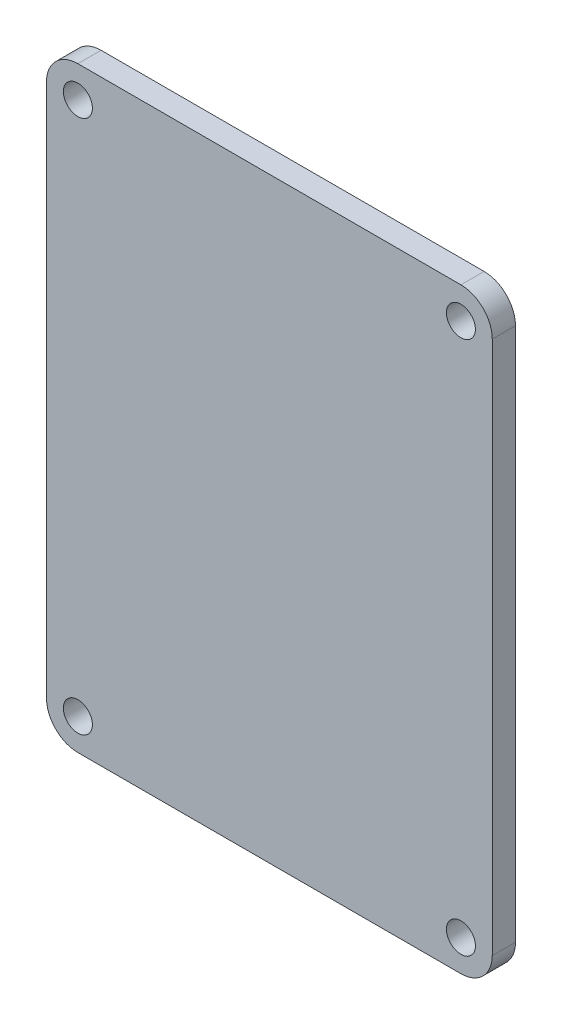
ISO-10303-21;
HEADER;
FILE_DESCRIPTION(('STEP AP214'),'2;1');
FILE_NAME('part.step','',(''),(''),'','','');
FILE_SCHEMA(('AUTOMOTIVE_DESIGN { 1 0 10303 214 1 1 1 1 }'));
ENDSEC;
DATA;
#1=APPLICATION_CONTEXT('core data for automotive mechanical design processes');
#2=APPLICATION_PROTOCOL_DEFINITION('international standard','automotive_design',2000,#1);
#3=PRODUCT_CONTEXT('',#1,'mechanical');
#4=PRODUCT('Part','Part','',(#3));
#5=PRODUCT_RELATED_PRODUCT_CATEGORY('part','',(#4));
#6=PRODUCT_DEFINITION_FORMATION('','',#4);
#7=PRODUCT_DEFINITION_CONTEXT('part definition',#1,'design');
#8=PRODUCT_DEFINITION('design','',#6,#7);
#9=PRODUCT_DEFINITION_SHAPE('','',#8);
#10=(LENGTH_UNIT() NAMED_UNIT(*) SI_UNIT(.MILLI.,.METRE.));
#11=(NAMED_UNIT(*) PLANE_ANGLE_UNIT() SI_UNIT($,.RADIAN.));
#12=(NAMED_UNIT(*) SI_UNIT($,.STERADIAN.) SOLID_ANGLE_UNIT());
#13=UNCERTAINTY_MEASURE_WITH_UNIT(LENGTH_MEASURE(1.E-05),#10,'distance_accuracy_value','');
#14=(GEOMETRIC_REPRESENTATION_CONTEXT(3) GLOBAL_UNCERTAINTY_ASSIGNED_CONTEXT((#13)) GLOBAL_UNIT_ASSIGNED_CONTEXT((#10,
#11,#12)) REPRESENTATION_CONTEXT('',''));
#15=CARTESIAN_POINT('',(0.,0.,0.));
#16=DIRECTION('',(0.,0.,1.));
#17=DIRECTION('',(1.,0.,0.));
#18=AXIS2_PLACEMENT_3D('',#15,#16,#17);
#19=CARTESIAN_POINT('',(16.161651473896,0.,5.57911505586116));
#20=DIRECTION('',(-1.,0.,0.));
#21=DIRECTION('',(0.,0.,1.));
#22=AXIS2_PLACEMENT_3D('',#19,#20,#21);
#23=PLANE('',#22);
#24=DIRECTION('',(0.,1.,0.));
#25=VECTOR('',#24,1.);
#26=CARTESIAN_POINT('',(16.161651473896,0.,3.57911505586116));
#27=LINE('',#26,#25);
#28=CARTESIAN_POINT('',(16.161651473896,-27.5486521236593,3.57911505586116));
#29=VERTEX_POINT('',#28);
#30=CARTESIAN_POINT('',(16.161651473896,18.4513478763407,3.57911505586116));
#31=VERTEX_POINT('',#30);
#32=EDGE_CURVE('E133',#29,#31,#27,.T.);
#33=ORIENTED_EDGE('',*,*,#32,.T.);
#34=DIRECTION('',(0.,0.,-1.));
#35=VECTOR('',#34,1.);
#36=CARTESIAN_POINT('',(16.161651473896,18.4513478763407,5.57911505586116));
#37=LINE('',#36,#35);
#38=CARTESIAN_POINT('',(16.161651473896,18.4513478763407,5.57911505586116));
#39=VERTEX_POINT('',#38);
#40=EDGE_CURVE('E11',#39,#31,#37,.T.);
#41=ORIENTED_EDGE('',*,*,#40,.F.);
#42=DIRECTION('',(0.,1.,0.));
#43=VECTOR('',#42,1.);
#44=CARTESIAN_POINT('',(16.161651473896,0.,5.57911505586116));
#45=LINE('',#44,#43);
#46=CARTESIAN_POINT('',(16.161651473896,-27.5486521236593,5.57911505586116));
#47=VERTEX_POINT('',#46);
#48=EDGE_CURVE('E148',#47,#39,#45,.T.);
#49=ORIENTED_EDGE('',*,*,#48,.F.);
#50=DIRECTION('',(0.,0.,-1.));
#51=VECTOR('',#50,1.);
#52=CARTESIAN_POINT('',(16.161651473896,-27.5486521236593,5.57911505586116));
#53=LINE('',#52,#51);
#54=EDGE_CURVE('E129',#47,#29,#53,.T.);
#55=ORIENTED_EDGE('',*,*,#54,.T.);
#56=EDGE_LOOP('',(#33,#41,#49,#55));
#57=FACE_BOUND('',#56,.T.);
#58=ADVANCED_FACE('F37',(#57),#23,.F.);
#59=CARTESIAN_POINT('',(13.4616514738959,18.4513478763407,5.57911505586116));
#60=DIRECTION('',(0.,0.,-1.));
#61=DIRECTION('',(-1.,0.,0.));
#62=AXIS2_PLACEMENT_3D('',#59,#60,#61);
#63=CYLINDRICAL_SURFACE('',#62,2.70000000000008);
#64=CARTESIAN_POINT('',(13.4616514738959,18.4513478763407,3.57911505586116));
#65=DIRECTION('',(0.,0.,1.));
#66=DIRECTION('',(1.,0.,0.));
#67=AXIS2_PLACEMENT_3D('',#64,#65,#66);
#68=CIRCLE('',#67,2.70000000000008);
#69=CARTESIAN_POINT('',(13.4616514738959,21.1513478763407,3.57911505586116));
#70=VERTEX_POINT('',#69);
#71=EDGE_CURVE('E136',#31,#70,#68,.T.);
#72=ORIENTED_EDGE('',*,*,#71,.T.);
#73=DIRECTION('',(0.,0.,-1.));
#74=VECTOR('',#73,1.);
#75=CARTESIAN_POINT('',(13.4616514738959,21.1513478763407,5.57911505586116));
#76=LINE('',#75,#74);
#77=CARTESIAN_POINT('',(13.4616514738959,21.1513478763407,5.57911505586116));
#78=VERTEX_POINT('',#77);
#79=EDGE_CURVE('E45',#78,#70,#76,.T.);
#80=ORIENTED_EDGE('',*,*,#79,.F.);
#81=CARTESIAN_POINT('',(13.4616514738959,18.4513478763407,5.57911505586116));
#82=DIRECTION('',(0.,0.,1.));
#83=DIRECTION('',(1.,0.,0.));
#84=AXIS2_PLACEMENT_3D('',#81,#82,#83);
#85=CIRCLE('',#84,2.70000000000008);
#86=EDGE_CURVE('E96',#39,#78,#85,.T.);
#87=ORIENTED_EDGE('',*,*,#86,.F.);
#88=ORIENTED_EDGE('',*,*,#40,.T.);
#89=EDGE_LOOP('',(#72,#80,#87,#88));
#90=FACE_BOUND('',#89,.T.);
#91=ADVANCED_FACE('F244',(#90),#63,.T.);
#92=CARTESIAN_POINT('',(0.,21.1513478763407,5.57911505586116));
#93=DIRECTION('',(0.,-1.,0.));
#94=DIRECTION('',(1.,0.,0.));
#95=AXIS2_PLACEMENT_3D('',#92,#93,#94);
#96=PLANE('',#95);
#97=DIRECTION('',(-1.,0.,0.));
#98=VECTOR('',#97,1.);
#99=CARTESIAN_POINT('',(0.,21.1513478763407,3.57911505586116));
#100=LINE('',#99,#98);
#101=CARTESIAN_POINT('',(-19.5383485261041,21.1513478763405,3.57911505586116));
#102=VERTEX_POINT('',#101);
#103=EDGE_CURVE('E139',#70,#102,#100,.T.);
#104=ORIENTED_EDGE('',*,*,#103,.T.);
#105=DIRECTION('',(0.,0.,-1.));
#106=VECTOR('',#105,1.);
#107=CARTESIAN_POINT('',(-19.5383485261041,21.1513478763405,5.57911505586116));
#108=LINE('',#107,#106);
#109=CARTESIAN_POINT('',(-19.5383485261041,21.1513478763405,5.57911505586116));
#110=VERTEX_POINT('',#109);
#111=EDGE_CURVE('E155',#110,#102,#108,.T.);
#112=ORIENTED_EDGE('',*,*,#111,.F.);
#113=DIRECTION('',(-1.,0.,0.));
#114=VECTOR('',#113,1.);
#115=CARTESIAN_POINT('',(0.,21.1513478763407,5.57911505586116));
#116=LINE('',#115,#114);
#117=EDGE_CURVE('E163',#78,#110,#116,.T.);
#118=ORIENTED_EDGE('',*,*,#117,.F.);
#119=ORIENTED_EDGE('',*,*,#79,.T.);
#120=EDGE_LOOP('',(#104,#112,#118,#119));
#121=FACE_BOUND('',#120,.T.);
#122=ADVANCED_FACE('F161',(#121),#96,.F.);
#123=CARTESIAN_POINT('',(-19.538348526104,18.4513478763405,5.57911505586116));
#124=DIRECTION('',(0.,0.,-1.));
#125=DIRECTION('',(-1.,0.,0.));
#126=AXIS2_PLACEMENT_3D('',#123,#124,#125);
#127=CYLINDRICAL_SURFACE('',#126,2.7);
#128=CARTESIAN_POINT('',(-19.538348526104,18.4513478763405,3.57911505586116));
#129=DIRECTION('',(0.,0.,1.));
#130=DIRECTION('',(1.,0.,0.));
#131=AXIS2_PLACEMENT_3D('',#128,#129,#130);
#132=CIRCLE('',#131,2.7);
#133=CARTESIAN_POINT('',(-22.2383485261041,18.4513478763405,3.57911505586116));
#134=VERTEX_POINT('',#133);
#135=EDGE_CURVE('E141',#102,#134,#132,.T.);
#136=ORIENTED_EDGE('',*,*,#135,.T.);
#137=DIRECTION('',(0.,0.,-1.));
#138=VECTOR('',#137,1.);
#139=CARTESIAN_POINT('',(-22.2383485261041,18.4513478763405,5.57911505586116));
#140=LINE('',#139,#138);
#141=CARTESIAN_POINT('',(-22.2383485261041,18.4513478763405,5.57911505586116));
#142=VERTEX_POINT('',#141);
#143=EDGE_CURVE('E152',#142,#134,#140,.T.);
#144=ORIENTED_EDGE('',*,*,#143,.F.);
#145=CARTESIAN_POINT('',(-19.538348526104,18.4513478763405,5.57911505586116));
#146=DIRECTION('',(0.,0.,1.));
#147=DIRECTION('',(1.,0.,0.));
#148=AXIS2_PLACEMENT_3D('',#145,#146,#147);
#149=CIRCLE('',#148,2.7);
#150=EDGE_CURVE('E175',#110,#142,#149,.T.);
#151=ORIENTED_EDGE('',*,*,#150,.F.);
#152=ORIENTED_EDGE('',*,*,#111,.T.);
#153=EDGE_LOOP('',(#136,#144,#151,#152));
#154=FACE_BOUND('',#153,.T.);
#155=ADVANCED_FACE('F171',(#154),#127,.T.);
#156=CARTESIAN_POINT('',(-22.2383485261041,0.,5.57911505586116));
#157=DIRECTION('',(1.,0.,0.));
#158=DIRECTION('',(0.,0.,-1.));
#159=AXIS2_PLACEMENT_3D('',#156,#157,#158);
#160=PLANE('',#159);
#161=DIRECTION('',(0.,-1.,0.));
#162=VECTOR('',#161,1.);
#163=CARTESIAN_POINT('',(-22.2383485261041,0.,3.57911505586116));
#164=LINE('',#163,#162);
#165=CARTESIAN_POINT('',(-22.2383485261041,-27.5486521236594,3.57911505586116));
#166=VERTEX_POINT('',#165);
#167=EDGE_CURVE('E143',#134,#166,#164,.T.);
#168=ORIENTED_EDGE('',*,*,#167,.T.);
#169=DIRECTION('',(0.,0.,-1.));
#170=VECTOR('',#169,1.);
#171=CARTESIAN_POINT('',(-22.2383485261041,-27.5486521236594,5.57911505586116));
#172=LINE('',#171,#170);
#173=CARTESIAN_POINT('',(-22.2383485261041,-27.5486521236594,5.57911505586116));
#174=VERTEX_POINT('',#173);
#175=EDGE_CURVE('E124',#174,#166,#172,.T.);
#176=ORIENTED_EDGE('',*,*,#175,.F.);
#177=DIRECTION('',(0.,-1.,0.));
#178=VECTOR('',#177,1.);
#179=CARTESIAN_POINT('',(-22.2383485261041,0.,5.57911505586116));
#180=LINE('',#179,#178);
#181=EDGE_CURVE('E115',#142,#174,#180,.T.);
#182=ORIENTED_EDGE('',*,*,#181,.F.);
#183=ORIENTED_EDGE('',*,*,#143,.T.);
#184=EDGE_LOOP('',(#168,#176,#182,#183));
#185=FACE_BOUND('',#184,.T.);
#186=ADVANCED_FACE('F174',(#185),#160,.F.);
#187=CARTESIAN_POINT('',(-19.5383485261041,-27.5486521236594,5.57911505586116));
#188=DIRECTION('',(0.,0.,-1.));
#189=DIRECTION('',(-1.,0.,0.));
#190=AXIS2_PLACEMENT_3D('',#187,#188,#189);
#191=CYLINDRICAL_SURFACE('',#190,2.69999999999999);
#192=CARTESIAN_POINT('',(-19.5383485261041,-27.5486521236594,3.57911505586116));
#193=DIRECTION('',(0.,0.,1.));
#194=DIRECTION('',(1.,0.,0.));
#195=AXIS2_PLACEMENT_3D('',#192,#193,#194);
#196=CIRCLE('',#195,2.69999999999999);
#197=CARTESIAN_POINT('',(-19.5383485261041,-30.2486521236594,3.57911505586116));
#198=VERTEX_POINT('',#197);
#199=EDGE_CURVE('E123',#166,#198,#196,.T.);
#200=ORIENTED_EDGE('',*,*,#199,.T.);
#201=DIRECTION('',(0.,0.,-1.));
#202=VECTOR('',#201,1.);
#203=CARTESIAN_POINT('',(-19.5383485261041,-30.2486521236594,5.57911505586116));
#204=LINE('',#203,#202);
#205=CARTESIAN_POINT('',(-19.5383485261041,-30.2486521236594,5.57911505586116));
#206=VERTEX_POINT('',#205);
#207=EDGE_CURVE('E120',#206,#198,#204,.T.);
#208=ORIENTED_EDGE('',*,*,#207,.F.);
#209=CARTESIAN_POINT('',(-19.5383485261041,-27.5486521236594,5.57911505586116));
#210=DIRECTION('',(0.,0.,1.));
#211=DIRECTION('',(1.,0.,0.));
#212=AXIS2_PLACEMENT_3D('',#209,#210,#211);
#213=CIRCLE('',#212,2.69999999999999);
#214=EDGE_CURVE('E109',#174,#206,#213,.T.);
#215=ORIENTED_EDGE('',*,*,#214,.F.);
#216=ORIENTED_EDGE('',*,*,#175,.T.);
#217=EDGE_LOOP('',(#200,#208,#215,#216));
#218=FACE_BOUND('',#217,.T.);
#219=ADVANCED_FACE('F121',(#218),#191,.T.);
#220=CARTESIAN_POINT('',(0.,-30.2486521236594,5.57911505586116));
#221=DIRECTION('',(0.,1.,0.));
#222=DIRECTION('',(0.,0.,1.));
#223=AXIS2_PLACEMENT_3D('',#220,#221,#222);
#224=PLANE('',#223);
#225=DIRECTION('',(1.,0.,0.));
#226=VECTOR('',#225,1.);
#227=CARTESIAN_POINT('',(0.,-30.2486521236594,3.57911505586116));
#228=LINE('',#227,#226);
#229=CARTESIAN_POINT('',(13.461651473896,-30.2486521236594,3.57911505586116));
#230=VERTEX_POINT('',#229);
#231=EDGE_CURVE('E82',#198,#230,#228,.T.);
#232=ORIENTED_EDGE('',*,*,#231,.T.);
#233=DIRECTION('',(0.,0.,-1.));
#234=VECTOR('',#233,1.);
#235=CARTESIAN_POINT('',(13.461651473896,-30.2486521236594,5.57911505586116));
#236=LINE('',#235,#234);
#237=CARTESIAN_POINT('',(13.461651473896,-30.2486521236594,5.57911505586116));
#238=VERTEX_POINT('',#237);
#239=EDGE_CURVE('E125',#238,#230,#236,.T.);
#240=ORIENTED_EDGE('',*,*,#239,.F.);
#241=DIRECTION('',(1.,0.,0.));
#242=VECTOR('',#241,1.);
#243=CARTESIAN_POINT('',(0.,-30.2486521236594,5.57911505586116));
#244=LINE('',#243,#242);
#245=EDGE_CURVE('E113',#206,#238,#244,.T.);
#246=ORIENTED_EDGE('',*,*,#245,.F.);
#247=ORIENTED_EDGE('',*,*,#207,.T.);
#248=EDGE_LOOP('',(#232,#240,#246,#247));
#249=FACE_BOUND('',#248,.T.);
#250=ADVANCED_FACE('F127',(#249),#224,.F.);
#251=CARTESIAN_POINT('',(13.461651473896,-27.5486521236593,5.57911505586116));
#252=DIRECTION('',(0.,0.,-1.));
#253=DIRECTION('',(-1.,0.,0.));
#254=AXIS2_PLACEMENT_3D('',#251,#252,#253);
#255=CYLINDRICAL_SURFACE('',#254,2.70000000000006);
#256=CARTESIAN_POINT('',(13.461651473896,-27.5486521236593,3.57911505586116));
#257=DIRECTION('',(0.,0.,1.));
#258=DIRECTION('',(1.,0.,0.));
#259=AXIS2_PLACEMENT_3D('',#256,#257,#258);
#260=CIRCLE('',#259,2.70000000000006);
#261=EDGE_CURVE('E88',#230,#29,#260,.T.);
#262=ORIENTED_EDGE('',*,*,#261,.T.);
#263=ORIENTED_EDGE('',*,*,#54,.F.);
#264=CARTESIAN_POINT('',(13.461651473896,-27.5486521236593,5.57911505586116));
#265=DIRECTION('',(0.,0.,1.));
#266=DIRECTION('',(1.,0.,0.));
#267=AXIS2_PLACEMENT_3D('',#264,#265,#266);
#268=CIRCLE('',#267,2.70000000000006);
#269=EDGE_CURVE('E53',#238,#47,#268,.T.);
#270=ORIENTED_EDGE('',*,*,#269,.F.);
#271=ORIENTED_EDGE('',*,*,#239,.T.);
#272=EDGE_LOOP('',(#262,#263,#270,#271));
#273=FACE_BOUND('',#272,.T.);
#274=ADVANCED_FACE('F251',(#273),#255,.T.);
#275=CARTESIAN_POINT('',(0.,0.,5.57911505586116));
#276=DIRECTION('',(0.,0.,1.));
#277=DIRECTION('',(1.,0.,0.));
#278=AXIS2_PLACEMENT_3D('',#275,#276,#277);
#279=PLANE('',#278);
#280=CARTESIAN_POINT('',(-19.538348526104,18.4513478763405,5.57911505586116));
#281=DIRECTION('',(0.,0.,1.));
#282=DIRECTION('',(1.,0.,0.));
#283=AXIS2_PLACEMENT_3D('',#280,#281,#282);
#284=CIRCLE('',#283,1.25);
#285=CARTESIAN_POINT('',(-18.288348526104,18.4513478763405,5.57911505586116));
#286=VERTEX_POINT('',#285);
#287=EDGE_CURVE('E198',#286,#286,#284,.T.);
#288=ORIENTED_EDGE('',*,*,#287,.F.);
#289=EDGE_LOOP('',(#288));
#290=FACE_BOUND('',#289,.T.);
#291=CARTESIAN_POINT('',(13.4616514738959,18.4513478763407,5.57911505586116));
#292=DIRECTION('',(0.,0.,1.));
#293=DIRECTION('',(1.,0.,0.));
#294=AXIS2_PLACEMENT_3D('',#291,#292,#293);
#295=CIRCLE('',#294,1.25);
#296=CARTESIAN_POINT('',(14.7116514738959,18.4513478763407,5.57911505586116));
#297=VERTEX_POINT('',#296);
#298=EDGE_CURVE('E192',#297,#297,#295,.T.);
#299=ORIENTED_EDGE('',*,*,#298,.F.);
#300=EDGE_LOOP('',(#299));
#301=FACE_BOUND('',#300,.T.);
#302=CARTESIAN_POINT('',(13.461651473896,-27.5486521236593,5.57911505586116));
#303=DIRECTION('',(0.,0.,1.));
#304=DIRECTION('',(1.,0.,0.));
#305=AXIS2_PLACEMENT_3D('',#302,#303,#304);
#306=CIRCLE('',#305,1.25);
#307=CARTESIAN_POINT('',(14.711651473896,-27.5486521236593,5.57911505586116));
#308=VERTEX_POINT('',#307);
#309=EDGE_CURVE('E186',#308,#308,#306,.T.);
#310=ORIENTED_EDGE('',*,*,#309,.F.);
#311=EDGE_LOOP('',(#310));
#312=FACE_BOUND('',#311,.T.);
#313=CARTESIAN_POINT('',(-19.5383485261041,-27.5486521236594,5.57911505586116));
#314=DIRECTION('',(0.,0.,1.));
#315=DIRECTION('',(1.,0.,0.));
#316=AXIS2_PLACEMENT_3D('',#313,#314,#315);
#317=CIRCLE('',#316,1.25);
#318=CARTESIAN_POINT('',(-18.2883485261041,-27.5486521236594,5.57911505586116));
#319=VERTEX_POINT('',#318);
#320=EDGE_CURVE('E137',#319,#319,#317,.T.);
#321=ORIENTED_EDGE('',*,*,#320,.F.);
#322=EDGE_LOOP('',(#321));
#323=FACE_BOUND('',#322,.T.);
#324=ORIENTED_EDGE('',*,*,#48,.T.);
#325=ORIENTED_EDGE('',*,*,#86,.T.);
#326=ORIENTED_EDGE('',*,*,#117,.T.);
#327=ORIENTED_EDGE('',*,*,#150,.T.);
#328=ORIENTED_EDGE('',*,*,#181,.T.);
#329=ORIENTED_EDGE('',*,*,#214,.T.);
#330=ORIENTED_EDGE('',*,*,#245,.T.);
#331=ORIENTED_EDGE('',*,*,#269,.T.);
#332=EDGE_LOOP('',(#324,#325,#326,#327,#328,#329,#330,#331));
#333=FACE_BOUND('',#332,.T.);
#334=ADVANCED_FACE('F111',(#290,#301,#312,#323,#333),#279,.T.);
#335=CARTESIAN_POINT('',(0.,0.,3.57911505586116));
#336=DIRECTION('',(0.,0.,1.));
#337=DIRECTION('',(1.,0.,0.));
#338=AXIS2_PLACEMENT_3D('',#335,#336,#337);
#339=PLANE('',#338);
#340=CARTESIAN_POINT('',(-3.03834852610408,4.45134787634061,3.57911505586116));
#341=DIRECTION('',(0.,0.,-1.));
#342=DIRECTION('',(-1.,0.,0.));
#343=AXIS2_PLACEMENT_3D('',#340,#341,#342);
#344=CIRCLE('',#343,4.);
#345=CARTESIAN_POINT('',(-7.03834852610408,4.45134787634061,3.57911505586116));
#346=VERTEX_POINT('',#345);
#347=EDGE_CURVE('E205',#346,#346,#344,.T.);
#348=ORIENTED_EDGE('',*,*,#347,.F.);
#349=EDGE_LOOP('',(#348));
#350=FACE_BOUND('',#349,.T.);
#351=CARTESIAN_POINT('',(-19.538348526104,18.4513478763405,3.57911505586116));
#352=DIRECTION('',(0.,0.,-1.));
#353=DIRECTION('',(-1.,0.,0.));
#354=AXIS2_PLACEMENT_3D('',#351,#352,#353);
#355=CIRCLE('',#354,1.25);
#356=CARTESIAN_POINT('',(-20.788348526104,18.4513478763405,3.57911505586116));
#357=VERTEX_POINT('',#356);
#358=EDGE_CURVE('E201',#357,#357,#355,.T.);
#359=ORIENTED_EDGE('',*,*,#358,.F.);
#360=EDGE_LOOP('',(#359));
#361=FACE_BOUND('',#360,.T.);
#362=CARTESIAN_POINT('',(13.4616514738959,18.4513478763407,3.57911505586116));
#363=DIRECTION('',(0.,0.,-1.));
#364=DIRECTION('',(-1.,0.,0.));
#365=AXIS2_PLACEMENT_3D('',#362,#363,#364);
#366=CIRCLE('',#365,1.25);
#367=CARTESIAN_POINT('',(12.2116514738959,18.4513478763407,3.57911505586116));
#368=VERTEX_POINT('',#367);
#369=EDGE_CURVE('E195',#368,#368,#366,.T.);
#370=ORIENTED_EDGE('',*,*,#369,.F.);
#371=EDGE_LOOP('',(#370));
#372=FACE_BOUND('',#371,.T.);
#373=CARTESIAN_POINT('',(13.461651473896,-27.5486521236593,3.57911505586116));
#374=DIRECTION('',(0.,0.,-1.));
#375=DIRECTION('',(-1.,0.,0.));
#376=AXIS2_PLACEMENT_3D('',#373,#374,#375);
#377=CIRCLE('',#376,1.25);
#378=CARTESIAN_POINT('',(12.211651473896,-27.5486521236593,3.57911505586116));
#379=VERTEX_POINT('',#378);
#380=EDGE_CURVE('E189',#379,#379,#377,.T.);
#381=ORIENTED_EDGE('',*,*,#380,.F.);
#382=EDGE_LOOP('',(#381));
#383=FACE_BOUND('',#382,.T.);
#384=CARTESIAN_POINT('',(-19.5383485261041,-27.5486521236594,3.57911505586116));
#385=DIRECTION('',(0.,0.,-1.));
#386=DIRECTION('',(-1.,0.,0.));
#387=AXIS2_PLACEMENT_3D('',#384,#385,#386);
#388=CIRCLE('',#387,1.25);
#389=CARTESIAN_POINT('',(-20.7883485261041,-27.5486521236594,3.57911505586116));
#390=VERTEX_POINT('',#389);
#391=EDGE_CURVE('E183',#390,#390,#388,.T.);
#392=ORIENTED_EDGE('',*,*,#391,.F.);
#393=EDGE_LOOP('',(#392));
#394=FACE_BOUND('',#393,.T.);
#395=ORIENTED_EDGE('',*,*,#32,.F.);
#396=ORIENTED_EDGE('',*,*,#261,.F.);
#397=ORIENTED_EDGE('',*,*,#231,.F.);
#398=ORIENTED_EDGE('',*,*,#199,.F.);
#399=ORIENTED_EDGE('',*,*,#167,.F.);
#400=ORIENTED_EDGE('',*,*,#135,.F.);
#401=ORIENTED_EDGE('',*,*,#103,.F.);
#402=ORIENTED_EDGE('',*,*,#71,.F.);
#403=EDGE_LOOP('',(#395,#396,#397,#398,#399,#400,#401,#402));
#404=FACE_BOUND('',#403,.T.);
#405=ADVANCED_FACE('F167',(#350,#361,#372,#383,#394,#404),#339,.F.);
#406=CARTESIAN_POINT('',(-19.5383485261041,-27.5486521236594,3.57911505586116));
#407=DIRECTION('',(0.,0.,-1.));
#408=DIRECTION('',(-1.,0.,0.));
#409=AXIS2_PLACEMENT_3D('',#406,#407,#408);
#410=CYLINDRICAL_SURFACE('',#409,1.25);
#411=ORIENTED_EDGE('',*,*,#320,.T.);
#412=EDGE_LOOP('',(#411));
#413=FACE_BOUND('',#412,.T.);
#414=ORIENTED_EDGE('',*,*,#391,.T.);
#415=EDGE_LOOP('',(#414));
#416=FACE_BOUND('',#415,.T.);
#417=ADVANCED_FACE('F222',(#413,#416),#410,.F.);
#418=CARTESIAN_POINT('',(13.461651473896,-27.5486521236593,3.57911505586116));
#419=DIRECTION('',(0.,0.,-1.));
#420=DIRECTION('',(-1.,0.,0.));
#421=AXIS2_PLACEMENT_3D('',#418,#419,#420);
#422=CYLINDRICAL_SURFACE('',#421,1.25);
#423=ORIENTED_EDGE('',*,*,#309,.T.);
#424=EDGE_LOOP('',(#423));
#425=FACE_BOUND('',#424,.T.);
#426=ORIENTED_EDGE('',*,*,#380,.T.);
#427=EDGE_LOOP('',(#426));
#428=FACE_BOUND('',#427,.T.);
#429=ADVANCED_FACE('F233',(#425,#428),#422,.F.);
#430=CARTESIAN_POINT('',(13.4616514738959,18.4513478763407,3.57911505586116));
#431=DIRECTION('',(0.,0.,-1.));
#432=DIRECTION('',(-1.,0.,0.));
#433=AXIS2_PLACEMENT_3D('',#430,#431,#432);
#434=CYLINDRICAL_SURFACE('',#433,1.25);
#435=ORIENTED_EDGE('',*,*,#298,.T.);
#436=EDGE_LOOP('',(#435));
#437=FACE_BOUND('',#436,.T.);
#438=ORIENTED_EDGE('',*,*,#369,.T.);
#439=EDGE_LOOP('',(#438));
#440=FACE_BOUND('',#439,.T.);
#441=ADVANCED_FACE('F239',(#437,#440),#434,.F.);
#442=CARTESIAN_POINT('',(-19.538348526104,18.4513478763405,3.57911505586116));
#443=DIRECTION('',(0.,0.,-1.));
#444=DIRECTION('',(-1.,0.,0.));
#445=AXIS2_PLACEMENT_3D('',#442,#443,#444);
#446=CYLINDRICAL_SURFACE('',#445,1.25);
#447=ORIENTED_EDGE('',*,*,#287,.T.);
#448=EDGE_LOOP('',(#447));
#449=FACE_BOUND('',#448,.T.);
#450=ORIENTED_EDGE('',*,*,#358,.T.);
#451=EDGE_LOOP('',(#450));
#452=FACE_BOUND('',#451,.T.);
#453=ADVANCED_FACE('F216',(#449,#452),#446,.F.);
#454=CARTESIAN_POINT('',(-3.03834852610408,4.45134787634061,4.17911505586116));
#455=DIRECTION('',(0.,0.,-1.));
#456=DIRECTION('',(-1.,0.,0.));
#457=AXIS2_PLACEMENT_3D('',#454,#455,#456);
#458=CYLINDRICAL_SURFACE('',#457,4.);
#459=CARTESIAN_POINT('',(-3.03834852610408,4.45134787634061,4.17911505586116));
#460=DIRECTION('',(0.,0.,-1.));
#461=DIRECTION('',(-1.,0.,0.));
#462=AXIS2_PLACEMENT_3D('',#459,#460,#461);
#463=CIRCLE('',#462,4.);
#464=CARTESIAN_POINT('',(-7.03834852610408,4.45134787634061,4.17911505586116));
#465=VERTEX_POINT('',#464);
#466=EDGE_CURVE('E204',#465,#465,#463,.T.);
#467=ORIENTED_EDGE('',*,*,#466,.F.);
#468=EDGE_LOOP('',(#467));
#469=FACE_BOUND('',#468,.T.);
#470=ORIENTED_EDGE('',*,*,#347,.T.);
#471=EDGE_LOOP('',(#470));
#472=FACE_BOUND('',#471,.T.);
#473=ADVANCED_FACE('F213',(#469,#472),#458,.F.);
#474=CARTESIAN_POINT('',(-3.03834852610408,4.45134787634061,4.17911505586116));
#475=DIRECTION('',(0.,0.,-1.));
#476=DIRECTION('',(-1.,0.,0.));
#477=AXIS2_PLACEMENT_3D('',#474,#475,#476);
#478=PLANE('',#477);
#479=ORIENTED_EDGE('',*,*,#466,.T.);
#480=EDGE_LOOP('',(#479));
#481=FACE_BOUND('',#480,.T.);
#482=ADVANCED_FACE('F211',(#481),#478,.T.);
#483=CLOSED_SHELL('',(#58,#91,#122,#155,#186,#219,#250,#274,#334,#405,#417,#429,#441,#453,#473,#482));
#484=MANIFOLD_SOLID_BREP('B2',#483);
#485=ADVANCED_BREP_SHAPE_REPRESENTATION('',(#18,#484),#14);
#486=SHAPE_DEFINITION_REPRESENTATION(#9,#485);
ENDSEC;
END-ISO-10303-21;
